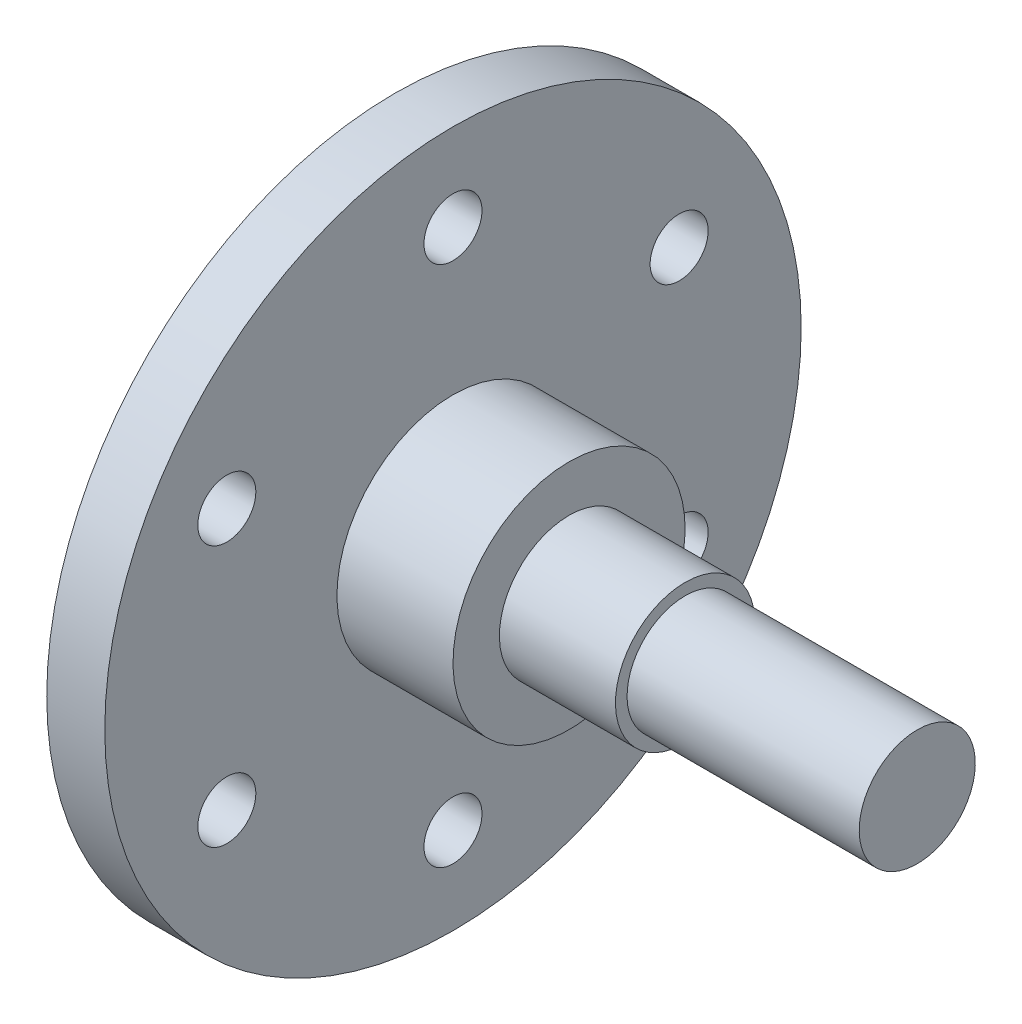
ISO-10303-21;
HEADER;
FILE_DESCRIPTION(('STEP AP214'),'2;1');
FILE_NAME('part.step','',(''),(''),'','','');
FILE_SCHEMA(('AUTOMOTIVE_DESIGN { 1 0 10303 214 1 1 1 1 }'));
ENDSEC;
DATA;
#1=APPLICATION_CONTEXT('core data for automotive mechanical design processes');
#2=APPLICATION_PROTOCOL_DEFINITION('international standard','automotive_design',2000,#1);
#3=PRODUCT_CONTEXT('',#1,'mechanical');
#4=PRODUCT('Part','Part','',(#3));
#5=PRODUCT_RELATED_PRODUCT_CATEGORY('part','',(#4));
#6=PRODUCT_DEFINITION_FORMATION('','',#4);
#7=PRODUCT_DEFINITION_CONTEXT('part definition',#1,'design');
#8=PRODUCT_DEFINITION('design','',#6,#7);
#9=PRODUCT_DEFINITION_SHAPE('','',#8);
#10=(LENGTH_UNIT() NAMED_UNIT(*) SI_UNIT(.MILLI.,.METRE.));
#11=(NAMED_UNIT(*) PLANE_ANGLE_UNIT() SI_UNIT($,.RADIAN.));
#12=(NAMED_UNIT(*) SI_UNIT($,.STERADIAN.) SOLID_ANGLE_UNIT());
#13=UNCERTAINTY_MEASURE_WITH_UNIT(LENGTH_MEASURE(1.E-05),#10,'distance_accuracy_value','');
#14=(GEOMETRIC_REPRESENTATION_CONTEXT(3) GLOBAL_UNCERTAINTY_ASSIGNED_CONTEXT((#13)) GLOBAL_UNIT_ASSIGNED_CONTEXT((#10,
#11,#12)) REPRESENTATION_CONTEXT('',''));
#15=CARTESIAN_POINT('',(0.,0.,0.));
#16=DIRECTION('',(0.,0.,1.));
#17=DIRECTION('',(1.,0.,0.));
#18=AXIS2_PLACEMENT_3D('',#15,#16,#17);
#19=CARTESIAN_POINT('',(45.,0.,0.));
#20=DIRECTION('',(-1.,0.,0.));
#21=DIRECTION('',(0.,-1.,0.));
#22=AXIS2_PLACEMENT_3D('',#19,#20,#21);
#23=PLANE('',#22);
#24=CARTESIAN_POINT('',(45.,0.,0.));
#25=DIRECTION('',(1.,0.,0.));
#26=DIRECTION('',(0.,1.,0.));
#27=AXIS2_PLACEMENT_3D('',#24,#25,#26);
#28=CIRCLE('',#27,5.);
#29=CARTESIAN_POINT('',(45.,5.,0.));
#30=VERTEX_POINT('',#29);
#31=EDGE_CURVE('E10',#30,#30,#28,.T.);
#32=ORIENTED_EDGE('',*,*,#31,.T.);
#33=EDGE_LOOP('',(#32));
#34=FACE_BOUND('',#33,.T.);
#35=ADVANCED_FACE('F44',(#34),#23,.F.);
#36=CARTESIAN_POINT('',(45.,0.,0.));
#37=DIRECTION('',(1.,0.,0.));
#38=DIRECTION('',(0.,1.,0.));
#39=AXIS2_PLACEMENT_3D('',#36,#37,#38);
#40=CYLINDRICAL_SURFACE('',#39,5.);
#41=ORIENTED_EDGE('',*,*,#31,.F.);
#42=EDGE_LOOP('',(#41));
#43=FACE_BOUND('',#42,.T.);
#44=CARTESIAN_POINT('',(25.,0.,0.));
#45=DIRECTION('',(1.,0.,0.));
#46=DIRECTION('',(0.,1.,0.));
#47=AXIS2_PLACEMENT_3D('',#44,#45,#46);
#48=CIRCLE('',#47,5.);
#49=CARTESIAN_POINT('',(25.,5.,0.));
#50=VERTEX_POINT('',#49);
#51=EDGE_CURVE('E51',#50,#50,#48,.T.);
#52=ORIENTED_EDGE('',*,*,#51,.T.);
#53=EDGE_LOOP('',(#52));
#54=FACE_BOUND('',#53,.T.);
#55=ADVANCED_FACE('F150',(#43,#54),#40,.T.);
#56=CARTESIAN_POINT('',(25.,0.,0.));
#57=DIRECTION('',(-1.,0.,0.));
#58=DIRECTION('',(0.,-1.,0.));
#59=AXIS2_PLACEMENT_3D('',#56,#57,#58);
#60=PLANE('',#59);
#61=ORIENTED_EDGE('',*,*,#51,.F.);
#62=EDGE_LOOP('',(#61));
#63=FACE_BOUND('',#62,.T.);
#64=CARTESIAN_POINT('',(25.,0.,0.));
#65=DIRECTION('',(1.,0.,0.));
#66=DIRECTION('',(0.,1.,0.));
#67=AXIS2_PLACEMENT_3D('',#64,#65,#66);
#68=CIRCLE('',#67,6.);
#69=CARTESIAN_POINT('',(25.,6.,0.));
#70=VERTEX_POINT('',#69);
#71=EDGE_CURVE('E54',#70,#70,#68,.T.);
#72=ORIENTED_EDGE('',*,*,#71,.T.);
#73=EDGE_LOOP('',(#72));
#74=FACE_BOUND('',#73,.T.);
#75=ADVANCED_FACE('F151',(#63,#74),#60,.F.);
#76=CARTESIAN_POINT('',(45.,0.,0.));
#77=DIRECTION('',(1.,0.,0.));
#78=DIRECTION('',(0.,1.,0.));
#79=AXIS2_PLACEMENT_3D('',#76,#77,#78);
#80=CYLINDRICAL_SURFACE('',#79,6.);
#81=ORIENTED_EDGE('',*,*,#71,.F.);
#82=EDGE_LOOP('',(#81));
#83=FACE_BOUND('',#82,.T.);
#84=CARTESIAN_POINT('',(15.,0.,0.));
#85=DIRECTION('',(1.,0.,0.));
#86=DIRECTION('',(0.,1.,0.));
#87=AXIS2_PLACEMENT_3D('',#84,#85,#86);
#88=CIRCLE('',#87,5.99999999999999);
#89=CARTESIAN_POINT('',(15.,5.99999999999999,0.));
#90=VERTEX_POINT('',#89);
#91=EDGE_CURVE('E56',#90,#90,#88,.T.);
#92=ORIENTED_EDGE('',*,*,#91,.T.);
#93=EDGE_LOOP('',(#92));
#94=FACE_BOUND('',#93,.T.);
#95=ADVANCED_FACE('F156',(#83,#94),#80,.T.);
#96=CARTESIAN_POINT('',(15.,0.,0.));
#97=DIRECTION('',(-1.,0.,0.));
#98=DIRECTION('',(0.,-1.,0.));
#99=AXIS2_PLACEMENT_3D('',#96,#97,#98);
#100=PLANE('',#99);
#101=ORIENTED_EDGE('',*,*,#91,.F.);
#102=EDGE_LOOP('',(#101));
#103=FACE_BOUND('',#102,.T.);
#104=CARTESIAN_POINT('',(15.,0.,0.));
#105=DIRECTION('',(1.,0.,0.));
#106=DIRECTION('',(0.,1.,0.));
#107=AXIS2_PLACEMENT_3D('',#104,#105,#106);
#108=CIRCLE('',#107,9.99999999999999);
#109=CARTESIAN_POINT('',(15.,9.99999999999999,0.));
#110=VERTEX_POINT('',#109);
#111=EDGE_CURVE('E61',#110,#110,#108,.T.);
#112=ORIENTED_EDGE('',*,*,#111,.T.);
#113=EDGE_LOOP('',(#112));
#114=FACE_BOUND('',#113,.T.);
#115=ADVANCED_FACE('F165',(#103,#114),#100,.F.);
#116=CARTESIAN_POINT('',(45.,0.,0.));
#117=DIRECTION('',(1.,0.,0.));
#118=DIRECTION('',(0.,1.,0.));
#119=AXIS2_PLACEMENT_3D('',#116,#117,#118);
#120=CYLINDRICAL_SURFACE('',#119,9.99999999999999);
#121=ORIENTED_EDGE('',*,*,#111,.F.);
#122=EDGE_LOOP('',(#121));
#123=FACE_BOUND('',#122,.T.);
#124=CARTESIAN_POINT('',(5.,0.,0.));
#125=DIRECTION('',(1.,0.,0.));
#126=DIRECTION('',(0.,1.,0.));
#127=AXIS2_PLACEMENT_3D('',#124,#125,#126);
#128=CIRCLE('',#127,9.99999999999999);
#129=CARTESIAN_POINT('',(5.,9.99999999999999,0.));
#130=VERTEX_POINT('',#129);
#131=EDGE_CURVE('E70',#130,#130,#128,.T.);
#132=ORIENTED_EDGE('',*,*,#131,.T.);
#133=EDGE_LOOP('',(#132));
#134=FACE_BOUND('',#133,.T.);
#135=ADVANCED_FACE('F142',(#123,#134),#120,.T.);
#136=CARTESIAN_POINT('',(4.99999999999999,0.,0.));
#137=DIRECTION('',(-1.,0.,0.));
#138=DIRECTION('',(0.,-1.,0.));
#139=AXIS2_PLACEMENT_3D('',#136,#137,#138);
#140=PLANE('',#139);
#141=CARTESIAN_POINT('',(4.99999999999999,22.5,-1.55528883222884E-13));
#142=DIRECTION('',(-1.,0.,0.));
#143=DIRECTION('',(0.,-1.,0.));
#144=AXIS2_PLACEMENT_3D('',#141,#142,#143);
#145=CIRCLE('',#144,2.5);
#146=CARTESIAN_POINT('',(4.99999999999998,20.,-1.55528883222884E-13));
#147=VERTEX_POINT('',#146);
#148=EDGE_CURVE('E77',#147,#147,#145,.T.);
#149=ORIENTED_EDGE('',*,*,#148,.T.);
#150=EDGE_LOOP('',(#149));
#151=FACE_BOUND('',#150,.T.);
#152=CARTESIAN_POINT('',(4.99999999999999,11.2500000000037,-19.4855715851479));
#153=DIRECTION('',(-1.,0.,0.));
#154=DIRECTION('',(0.,-1.,0.));
#155=AXIS2_PLACEMENT_3D('',#152,#153,#154);
#156=CIRCLE('',#155,2.5);
#157=CARTESIAN_POINT('',(4.99999999999998,8.75000000000367,-19.4855715851479));
#158=VERTEX_POINT('',#157);
#159=EDGE_CURVE('E76',#158,#158,#156,.T.);
#160=ORIENTED_EDGE('',*,*,#159,.T.);
#161=EDGE_LOOP('',(#160));
#162=FACE_BOUND('',#161,.T.);
#163=CARTESIAN_POINT('',(4.99999999999999,-11.2499999999971,-19.4855715851517));
#164=DIRECTION('',(-1.,0.,0.));
#165=DIRECTION('',(0.,-1.,0.));
#166=AXIS2_PLACEMENT_3D('',#163,#164,#165);
#167=CIRCLE('',#166,2.5);
#168=CARTESIAN_POINT('',(4.99999999999998,-13.7499999999971,-19.4855715851517));
#169=VERTEX_POINT('',#168);
#170=EDGE_CURVE('E85',#169,#169,#167,.T.);
#171=ORIENTED_EDGE('',*,*,#170,.T.);
#172=EDGE_LOOP('',(#171));
#173=FACE_BOUND('',#172,.T.);
#174=CARTESIAN_POINT('',(4.99999999999999,-22.5,-2.69074326221791E-12));
#175=DIRECTION('',(-1.,0.,0.));
#176=DIRECTION('',(0.,-1.,0.));
#177=AXIS2_PLACEMENT_3D('',#174,#175,#176);
#178=CIRCLE('',#177,2.5);
#179=CARTESIAN_POINT('',(4.99999999999998,-25.,-2.69074326221791E-12));
#180=VERTEX_POINT('',#179);
#181=EDGE_CURVE('E84',#180,#180,#178,.T.);
#182=ORIENTED_EDGE('',*,*,#181,.T.);
#183=EDGE_LOOP('',(#182));
#184=FACE_BOUND('',#183,.T.);
#185=CARTESIAN_POINT('',(4.99999999999999,-11.2500000000015,19.4855715851489));
#186=DIRECTION('',(-1.,0.,0.));
#187=DIRECTION('',(0.,-1.,0.));
#188=AXIS2_PLACEMENT_3D('',#185,#186,#187);
#189=CIRCLE('',#188,2.5);
#190=CARTESIAN_POINT('',(4.99999999999998,-13.7500000000015,19.4855715851489));
#191=VERTEX_POINT('',#190);
#192=EDGE_CURVE('E86',#191,#191,#189,.T.);
#193=ORIENTED_EDGE('',*,*,#192,.T.);
#194=EDGE_LOOP('',(#193));
#195=FACE_BOUND('',#194,.T.);
#196=CARTESIAN_POINT('',(4.99999999999999,11.2499999999993,19.4855715851501));
#197=DIRECTION('',(-1.,0.,0.));
#198=DIRECTION('',(0.,-1.,0.));
#199=AXIS2_PLACEMENT_3D('',#196,#197,#198);
#200=CIRCLE('',#199,2.5);
#201=CARTESIAN_POINT('',(4.99999999999998,8.74999999999927,19.4855715851501));
#202=VERTEX_POINT('',#201);
#203=EDGE_CURVE('E93',#202,#202,#200,.T.);
#204=ORIENTED_EDGE('',*,*,#203,.T.);
#205=EDGE_LOOP('',(#204));
#206=FACE_BOUND('',#205,.T.);
#207=ORIENTED_EDGE('',*,*,#131,.F.);
#208=EDGE_LOOP('',(#207));
#209=FACE_BOUND('',#208,.T.);
#210=CARTESIAN_POINT('',(4.99999999999999,0.,0.));
#211=DIRECTION('',(1.,0.,0.));
#212=DIRECTION('',(0.,1.,0.));
#213=AXIS2_PLACEMENT_3D('',#210,#211,#212);
#214=CIRCLE('',#213,30.);
#215=CARTESIAN_POINT('',(4.99999999999999,30.,0.));
#216=VERTEX_POINT('',#215);
#217=EDGE_CURVE('E69',#216,#216,#214,.T.);
#218=ORIENTED_EDGE('',*,*,#217,.T.);
#219=EDGE_LOOP('',(#218));
#220=FACE_BOUND('',#219,.T.);
#221=ADVANCED_FACE('F133',(#151,#162,#173,#184,#195,#206,#209,#220),#140,.F.);
#222=CARTESIAN_POINT('',(45.,0.,0.));
#223=DIRECTION('',(1.,0.,0.));
#224=DIRECTION('',(0.,1.,0.));
#225=AXIS2_PLACEMENT_3D('',#222,#223,#224);
#226=CYLINDRICAL_SURFACE('',#225,30.);
#227=ORIENTED_EDGE('',*,*,#217,.F.);
#228=EDGE_LOOP('',(#227));
#229=FACE_BOUND('',#228,.T.);
#230=CARTESIAN_POINT('',(0.,0.,0.));
#231=DIRECTION('',(1.,0.,0.));
#232=DIRECTION('',(0.,1.,0.));
#233=AXIS2_PLACEMENT_3D('',#230,#231,#232);
#234=CIRCLE('',#233,30.);
#235=CARTESIAN_POINT('',(0.,30.,0.));
#236=VERTEX_POINT('',#235);
#237=EDGE_CURVE('E71',#236,#236,#234,.T.);
#238=ORIENTED_EDGE('',*,*,#237,.T.);
#239=EDGE_LOOP('',(#238));
#240=FACE_BOUND('',#239,.T.);
#241=ADVANCED_FACE('F118',(#229,#240),#226,.T.);
#242=CARTESIAN_POINT('',(0.,0.,0.));
#243=DIRECTION('',(1.,0.,0.));
#244=DIRECTION('',(0.,1.,0.));
#245=AXIS2_PLACEMENT_3D('',#242,#243,#244);
#246=PLANE('',#245);
#247=CARTESIAN_POINT('',(0.,22.5,-1.55528883222884E-13));
#248=DIRECTION('',(-1.,0.,0.));
#249=DIRECTION('',(0.,-1.,0.));
#250=AXIS2_PLACEMENT_3D('',#247,#248,#249);
#251=CIRCLE('',#250,2.5);
#252=CARTESIAN_POINT('',(0.,20.,-1.55528883222884E-13));
#253=VERTEX_POINT('',#252);
#254=EDGE_CURVE('E94',#253,#253,#251,.T.);
#255=ORIENTED_EDGE('',*,*,#254,.F.);
#256=EDGE_LOOP('',(#255));
#257=FACE_BOUND('',#256,.T.);
#258=CARTESIAN_POINT('',(0.,11.2500000000037,-19.4855715851479));
#259=DIRECTION('',(-1.,0.,0.));
#260=DIRECTION('',(0.,-1.,0.));
#261=AXIS2_PLACEMENT_3D('',#258,#259,#260);
#262=CIRCLE('',#261,2.5);
#263=CARTESIAN_POINT('',(0.,8.75000000000367,-19.4855715851479));
#264=VERTEX_POINT('',#263);
#265=EDGE_CURVE('E97',#264,#264,#262,.T.);
#266=ORIENTED_EDGE('',*,*,#265,.F.);
#267=EDGE_LOOP('',(#266));
#268=FACE_BOUND('',#267,.T.);
#269=CARTESIAN_POINT('',(0.,-11.2499999999971,-19.4855715851517));
#270=DIRECTION('',(-1.,0.,0.));
#271=DIRECTION('',(0.,-1.,0.));
#272=AXIS2_PLACEMENT_3D('',#269,#270,#271);
#273=CIRCLE('',#272,2.5);
#274=CARTESIAN_POINT('',(0.,-13.7499999999971,-19.4855715851517));
#275=VERTEX_POINT('',#274);
#276=EDGE_CURVE('E92',#275,#275,#273,.T.);
#277=ORIENTED_EDGE('',*,*,#276,.F.);
#278=EDGE_LOOP('',(#277));
#279=FACE_BOUND('',#278,.T.);
#280=CARTESIAN_POINT('',(0.,-22.5,-2.69074326221791E-12));
#281=DIRECTION('',(-1.,0.,0.));
#282=DIRECTION('',(0.,-1.,0.));
#283=AXIS2_PLACEMENT_3D('',#280,#281,#282);
#284=CIRCLE('',#283,2.5);
#285=CARTESIAN_POINT('',(0.,-25.,-2.69074326221791E-12));
#286=VERTEX_POINT('',#285);
#287=EDGE_CURVE('E98',#286,#286,#284,.T.);
#288=ORIENTED_EDGE('',*,*,#287,.F.);
#289=EDGE_LOOP('',(#288));
#290=FACE_BOUND('',#289,.T.);
#291=CARTESIAN_POINT('',(0.,-11.2500000000015,19.4855715851489));
#292=DIRECTION('',(-1.,0.,0.));
#293=DIRECTION('',(0.,-1.,0.));
#294=AXIS2_PLACEMENT_3D('',#291,#292,#293);
#295=CIRCLE('',#294,2.5);
#296=CARTESIAN_POINT('',(0.,-13.7500000000015,19.4855715851489));
#297=VERTEX_POINT('',#296);
#298=EDGE_CURVE('E105',#297,#297,#295,.T.);
#299=ORIENTED_EDGE('',*,*,#298,.F.);
#300=EDGE_LOOP('',(#299));
#301=FACE_BOUND('',#300,.T.);
#302=CARTESIAN_POINT('',(0.,11.2499999999993,19.4855715851501));
#303=DIRECTION('',(-1.,0.,0.));
#304=DIRECTION('',(0.,-1.,0.));
#305=AXIS2_PLACEMENT_3D('',#302,#303,#304);
#306=CIRCLE('',#305,2.5);
#307=CARTESIAN_POINT('',(0.,8.74999999999927,19.4855715851501));
#308=VERTEX_POINT('',#307);
#309=EDGE_CURVE('E104',#308,#308,#306,.T.);
#310=ORIENTED_EDGE('',*,*,#309,.F.);
#311=EDGE_LOOP('',(#310));
#312=FACE_BOUND('',#311,.T.);
#313=ORIENTED_EDGE('',*,*,#237,.F.);
#314=EDGE_LOOP('',(#313));
#315=FACE_BOUND('',#314,.T.);
#316=ADVANCED_FACE('F117',(#257,#268,#279,#290,#301,#312,#315),#246,.F.);
#317=CARTESIAN_POINT('',(45.,11.2499999999993,19.4855715851501));
#318=DIRECTION('',(-1.,0.,0.));
#319=DIRECTION('',(0.,-1.,0.));
#320=AXIS2_PLACEMENT_3D('',#317,#318,#319);
#321=CYLINDRICAL_SURFACE('',#320,2.5);
#322=CARTESIAN_POINT('',(0.,8.74999999999927,19.4855715851501));
#323=CARTESIAN_POINT('',(0.0520833333333392,8.74999999999927,19.4855715851501));
#324=CARTESIAN_POINT('',(0.104166666666671,8.74999999999927,19.4855715851501));
#325=CARTESIAN_POINT('',(0.208333333333338,8.74999999999927,19.4855715851501));
#326=CARTESIAN_POINT('',(0.260416666666673,8.74999999999927,19.4855715851501));
#327=CARTESIAN_POINT('',(0.364583333333339,8.74999999999927,19.4855715851501));
#328=CARTESIAN_POINT('',(0.416666666666672,8.74999999999927,19.4855715851501));
#329=CARTESIAN_POINT('',(0.520833333333338,8.74999999999927,19.4855715851501));
#330=CARTESIAN_POINT('',(0.572916666666673,8.74999999999927,19.4855715851501));
#331=CARTESIAN_POINT('',(0.67708333333334,8.74999999999927,19.4855715851501));
#332=CARTESIAN_POINT('',(0.729166666666672,8.74999999999927,19.4855715851501));
#333=CARTESIAN_POINT('',(0.833333333333336,8.74999999999927,19.4855715851501));
#334=CARTESIAN_POINT('',(0.885416666666669,8.74999999999927,19.4855715851501));
#335=CARTESIAN_POINT('',(0.989583333333335,8.74999999999927,19.4855715851501));
#336=CARTESIAN_POINT('',(1.04166666666667,8.74999999999927,19.4855715851501));
#337=CARTESIAN_POINT('',(1.14583333333334,8.74999999999927,19.4855715851501));
#338=CARTESIAN_POINT('',(1.19791666666667,8.74999999999927,19.4855715851501));
#339=CARTESIAN_POINT('',(1.30208333333333,8.74999999999927,19.4855715851501));
#340=CARTESIAN_POINT('',(1.35416666666667,8.74999999999927,19.4855715851501));
#341=CARTESIAN_POINT('',(1.45833333333333,8.74999999999927,19.4855715851501));
#342=CARTESIAN_POINT('',(1.51041666666667,8.74999999999927,19.4855715851501));
#343=CARTESIAN_POINT('',(1.61458333333333,8.74999999999927,19.4855715851501));
#344=CARTESIAN_POINT('',(1.66666666666667,8.74999999999927,19.4855715851501));
#345=CARTESIAN_POINT('',(1.77083333333333,8.74999999999927,19.4855715851501));
#346=CARTESIAN_POINT('',(1.82291666666666,8.74999999999927,19.4855715851501));
#347=CARTESIAN_POINT('',(1.92708333333333,8.74999999999927,19.4855715851501));
#348=CARTESIAN_POINT('',(1.97916666666666,8.74999999999927,19.4855715851501));
#349=CARTESIAN_POINT('',(2.08333333333333,8.74999999999927,19.4855715851501));
#350=CARTESIAN_POINT('',(2.13541666666666,8.74999999999927,19.4855715851501));
#351=CARTESIAN_POINT('',(2.23958333333333,8.74999999999927,19.4855715851501));
#352=CARTESIAN_POINT('',(2.29166666666666,8.74999999999927,19.4855715851501));
#353=CARTESIAN_POINT('',(2.39583333333333,8.74999999999927,19.4855715851501));
#354=CARTESIAN_POINT('',(2.44791666666666,8.74999999999927,19.4855715851501));
#355=CARTESIAN_POINT('',(2.55208333333333,8.74999999999927,19.4855715851501));
#356=CARTESIAN_POINT('',(2.60416666666666,8.74999999999927,19.4855715851501));
#357=CARTESIAN_POINT('',(2.70833333333333,8.74999999999927,19.4855715851501));
#358=CARTESIAN_POINT('',(2.76041666666666,8.74999999999927,19.4855715851501));
#359=CARTESIAN_POINT('',(2.86458333333333,8.74999999999927,19.4855715851501));
#360=CARTESIAN_POINT('',(2.91666666666666,8.74999999999927,19.4855715851501));
#361=CARTESIAN_POINT('',(3.02083333333333,8.74999999999927,19.4855715851501));
#362=CARTESIAN_POINT('',(3.07291666666666,8.74999999999927,19.4855715851501));
#363=CARTESIAN_POINT('',(3.17708333333333,8.74999999999927,19.4855715851501));
#364=CARTESIAN_POINT('',(3.22916666666666,8.74999999999927,19.4855715851501));
#365=CARTESIAN_POINT('',(3.33333333333333,8.74999999999927,19.4855715851501));
#366=CARTESIAN_POINT('',(3.38541666666666,8.74999999999927,19.4855715851501));
#367=CARTESIAN_POINT('',(3.48958333333332,8.74999999999927,19.4855715851501));
#368=CARTESIAN_POINT('',(3.54166666666666,8.74999999999927,19.4855715851501));
#369=CARTESIAN_POINT('',(3.64583333333333,8.74999999999927,19.4855715851501));
#370=CARTESIAN_POINT('',(3.69791666666666,8.74999999999927,19.4855715851501));
#371=CARTESIAN_POINT('',(3.80208333333332,8.74999999999927,19.4855715851501));
#372=CARTESIAN_POINT('',(3.85416666666665,8.74999999999927,19.4855715851501));
#373=CARTESIAN_POINT('',(3.95833333333332,8.74999999999927,19.4855715851501));
#374=CARTESIAN_POINT('',(4.01041666666666,8.74999999999927,19.4855715851501));
#375=CARTESIAN_POINT('',(4.11458333333332,8.74999999999927,19.4855715851501));
#376=CARTESIAN_POINT('',(4.16666666666665,8.74999999999927,19.4855715851501));
#377=CARTESIAN_POINT('',(4.27083333333332,8.74999999999927,19.4855715851501));
#378=CARTESIAN_POINT('',(4.32291666666665,8.74999999999927,19.4855715851501));
#379=CARTESIAN_POINT('',(4.42708333333332,8.74999999999927,19.4855715851501));
#380=CARTESIAN_POINT('',(4.47916666666665,8.74999999999927,19.4855715851501));
#381=CARTESIAN_POINT('',(4.58333333333332,8.74999999999927,19.4855715851501));
#382=CARTESIAN_POINT('',(4.63541666666665,8.74999999999927,19.4855715851501));
#383=CARTESIAN_POINT('',(4.73958333333332,8.74999999999927,19.4855715851501));
#384=CARTESIAN_POINT('',(4.79166666666665,8.74999999999927,19.4855715851501));
#385=CARTESIAN_POINT('',(4.89583333333332,8.74999999999927,19.4855715851501));
#386=CARTESIAN_POINT('',(4.94791666666665,8.74999999999927,19.4855715851501));
#387=CARTESIAN_POINT('',(4.99999999999998,8.74999999999927,19.4855715851501));
#388=B_SPLINE_CURVE_WITH_KNOTS('',3,(#322,#323,#324,#325,#326,#327,#328,#329,#330,#331,#332,
#333,#334,#335,#336,#337,#338,#339,#340,#341,#342,#343,#344,#345,#346,#347,#348,#349,#350,#351,
#352,#353,#354,#355,#356,#357,#358,#359,#360,#361,#362,#363,#364,#365,#366,#367,#368,#369,#370,
#371,#372,#373,#374,#375,#376,#377,#378,#379,#380,#381,#382,#383,#384,#385,#386,#387),
.UNSPECIFIED.,.F.,.F.,(4,2,2,2,2,2,2,2,2,2,2,2,2,2,2,2,2,2,2,2,2,2,2,2,2,2,2,2,2,2,2,2,4),(0.,
0.156249999999997,0.3125,0.468749999999997,0.625000000000001,0.781249999999997,
0.937499999999994,1.09375,1.24999999999999,1.40624999999999,1.56249999999999,1.71874999999999,
1.87499999999999,2.03124999999999,2.18749999999999,2.34374999999999,2.49999999999999,
2.65624999999998,2.81249999999999,2.96874999999999,3.12499999999999,3.28124999999999,
3.43749999999998,3.59374999999999,3.74999999999998,3.90624999999998,4.06249999999998,
4.21874999999998,4.37499999999998,4.53124999999998,4.68749999999998,4.84374999999998,
4.99999999999998),.UNSPECIFIED.);
#389=EDGE_CURVE('BSEAM116',#308,#202,#388,.T.);
#390=ORIENTED_EDGE('',*,*,#309,.T.);
#391=ORIENTED_EDGE('',*,*,#203,.F.);
#392=ORIENTED_EDGE('',*,*,#389,.T.);
#393=ORIENTED_EDGE('',*,*,#389,.F.);
#394=EDGE_LOOP('',(#390,#392,#391,#393));
#395=FACE_BOUND('',#394,.T.);
#396=ADVANCED_FACE('F116',(#395),#321,.F.);
#397=CARTESIAN_POINT('',(45.,-11.2500000000015,19.4855715851489));
#398=DIRECTION('',(-1.,0.,0.));
#399=DIRECTION('',(0.,-1.,0.));
#400=AXIS2_PLACEMENT_3D('',#397,#398,#399);
#401=CYLINDRICAL_SURFACE('',#400,2.5);
#402=CARTESIAN_POINT('',(0.,-13.7500000000015,19.4855715851489));
#403=CARTESIAN_POINT('',(0.0520833333333253,-13.7500000000015,19.4855715851489));
#404=CARTESIAN_POINT('',(0.104166666666657,-13.7500000000015,19.4855715851489));
#405=CARTESIAN_POINT('',(0.208333333333324,-13.7500000000015,19.4855715851489));
#406=CARTESIAN_POINT('',(0.260416666666659,-13.7500000000015,19.4855715851489));
#407=CARTESIAN_POINT('',(0.364583333333326,-13.7500000000015,19.4855715851489));
#408=CARTESIAN_POINT('',(0.416666666666658,-13.7500000000015,19.4855715851489));
#409=CARTESIAN_POINT('',(0.520833333333325,-13.7500000000015,19.4855715851489));
#410=CARTESIAN_POINT('',(0.572916666666659,-13.7500000000015,19.4855715851489));
#411=CARTESIAN_POINT('',(0.677083333333326,-13.7500000000015,19.4855715851489));
#412=CARTESIAN_POINT('',(0.729166666666658,-13.7500000000015,19.4855715851489));
#413=CARTESIAN_POINT('',(0.833333333333325,-13.7500000000015,19.4855715851489));
#414=CARTESIAN_POINT('',(0.885416666666659,-13.7500000000015,19.4855715851489));
#415=CARTESIAN_POINT('',(0.989583333333326,-13.7500000000015,19.4855715851489));
#416=CARTESIAN_POINT('',(1.04166666666666,-13.7500000000015,19.4855715851489));
#417=CARTESIAN_POINT('',(1.14583333333333,-13.7500000000015,19.4855715851489));
#418=CARTESIAN_POINT('',(1.19791666666666,-13.7500000000015,19.4855715851489));
#419=CARTESIAN_POINT('',(1.30208333333333,-13.7500000000015,19.4855715851489));
#420=CARTESIAN_POINT('',(1.35416666666666,-13.7500000000015,19.4855715851489));
#421=CARTESIAN_POINT('',(1.45833333333332,-13.7500000000015,19.4855715851489));
#422=CARTESIAN_POINT('',(1.51041666666666,-13.7500000000015,19.4855715851489));
#423=CARTESIAN_POINT('',(1.61458333333332,-13.7500000000015,19.4855715851489));
#424=CARTESIAN_POINT('',(1.66666666666666,-13.7500000000015,19.4855715851489));
#425=CARTESIAN_POINT('',(1.77083333333332,-13.7500000000015,19.4855715851489));
#426=CARTESIAN_POINT('',(1.82291666666666,-13.7500000000015,19.4855715851489));
#427=CARTESIAN_POINT('',(1.92708333333332,-13.7500000000015,19.4855715851489));
#428=CARTESIAN_POINT('',(1.97916666666666,-13.7500000000015,19.4855715851489));
#429=CARTESIAN_POINT('',(2.08333333333332,-13.7500000000015,19.4855715851489));
#430=CARTESIAN_POINT('',(2.13541666666666,-13.7500000000015,19.4855715851489));
#431=CARTESIAN_POINT('',(2.23958333333332,-13.7500000000015,19.4855715851489));
#432=CARTESIAN_POINT('',(2.29166666666666,-13.7500000000015,19.4855715851489));
#433=CARTESIAN_POINT('',(2.39583333333332,-13.7500000000015,19.4855715851489));
#434=CARTESIAN_POINT('',(2.44791666666666,-13.7500000000015,19.4855715851489));
#435=CARTESIAN_POINT('',(2.55208333333332,-13.7500000000015,19.4855715851489));
#436=CARTESIAN_POINT('',(2.60416666666665,-13.7500000000015,19.4855715851489));
#437=CARTESIAN_POINT('',(2.70833333333332,-13.7500000000015,19.4855715851489));
#438=CARTESIAN_POINT('',(2.76041666666665,-13.7500000000015,19.4855715851489));
#439=CARTESIAN_POINT('',(2.86458333333332,-13.7500000000015,19.4855715851489));
#440=CARTESIAN_POINT('',(2.91666666666665,-13.7500000000015,19.4855715851489));
#441=CARTESIAN_POINT('',(3.02083333333332,-13.7500000000015,19.4855715851489));
#442=CARTESIAN_POINT('',(3.07291666666665,-13.7500000000015,19.4855715851489));
#443=CARTESIAN_POINT('',(3.17708333333332,-13.7500000000015,19.4855715851489));
#444=CARTESIAN_POINT('',(3.22916666666665,-13.7500000000015,19.4855715851489));
#445=CARTESIAN_POINT('',(3.33333333333332,-13.7500000000015,19.4855715851489));
#446=CARTESIAN_POINT('',(3.38541666666665,-13.7500000000015,19.4855715851489));
#447=CARTESIAN_POINT('',(3.48958333333332,-13.7500000000015,19.4855715851489));
#448=CARTESIAN_POINT('',(3.54166666666665,-13.7500000000015,19.4855715851489));
#449=CARTESIAN_POINT('',(3.64583333333332,-13.7500000000015,19.4855715851489));
#450=CARTESIAN_POINT('',(3.69791666666665,-13.7500000000015,19.4855715851489));
#451=CARTESIAN_POINT('',(3.80208333333332,-13.7500000000015,19.4855715851489));
#452=CARTESIAN_POINT('',(3.85416666666665,-13.7500000000015,19.4855715851489));
#453=CARTESIAN_POINT('',(3.95833333333332,-13.7500000000015,19.4855715851489));
#454=CARTESIAN_POINT('',(4.01041666666665,-13.7500000000015,19.4855715851489));
#455=CARTESIAN_POINT('',(4.11458333333332,-13.7500000000015,19.4855715851489));
#456=CARTESIAN_POINT('',(4.16666666666665,-13.7500000000015,19.4855715851489));
#457=CARTESIAN_POINT('',(4.27083333333332,-13.7500000000015,19.4855715851489));
#458=CARTESIAN_POINT('',(4.32291666666665,-13.7500000000015,19.4855715851489));
#459=CARTESIAN_POINT('',(4.42708333333332,-13.7500000000015,19.4855715851489));
#460=CARTESIAN_POINT('',(4.47916666666665,-13.7500000000015,19.4855715851489));
#461=CARTESIAN_POINT('',(4.58333333333332,-13.7500000000015,19.4855715851489));
#462=CARTESIAN_POINT('',(4.63541666666665,-13.7500000000015,19.4855715851489));
#463=CARTESIAN_POINT('',(4.73958333333332,-13.7500000000015,19.4855715851489));
#464=CARTESIAN_POINT('',(4.79166666666665,-13.7500000000015,19.4855715851489));
#465=CARTESIAN_POINT('',(4.89583333333332,-13.7500000000015,19.4855715851489));
#466=CARTESIAN_POINT('',(4.94791666666665,-13.7500000000015,19.4855715851489));
#467=CARTESIAN_POINT('',(4.99999999999998,-13.7500000000015,19.4855715851489));
#468=B_SPLINE_CURVE_WITH_KNOTS('',3,(#402,#403,#404,#405,#406,#407,#408,#409,#410,#411,#412,
#413,#414,#415,#416,#417,#418,#419,#420,#421,#422,#423,#424,#425,#426,#427,#428,#429,#430,#431,
#432,#433,#434,#435,#436,#437,#438,#439,#440,#441,#442,#443,#444,#445,#446,#447,#448,#449,#450,
#451,#452,#453,#454,#455,#456,#457,#458,#459,#460,#461,#462,#463,#464,#465,#466,#467),
.UNSPECIFIED.,.F.,.F.,(4,2,2,2,2,2,2,2,2,2,2,2,2,2,2,2,2,2,2,2,2,2,2,2,2,2,2,2,2,2,2,2,4),(0.,
0.156249999999997,0.3125,0.468749999999997,0.625000000000001,0.781249999999997,
0.937500000000001,1.09375,1.25,1.40625,1.56249999999999,1.71875,1.87499999999999,2.03125,2.1875,
2.34375,2.5,2.65624999999999,2.8125,2.96874999999999,3.125,3.28124999999999,3.4375,
3.59374999999999,3.74999999999999,3.90624999999999,4.06249999999999,4.21874999999999,
4.37499999999999,4.53124999999999,4.68749999999999,4.84374999999999,4.99999999999999),.UNSPECIFIED.);
#469=EDGE_CURVE('BSEAM223',#297,#191,#468,.T.);
#470=ORIENTED_EDGE('',*,*,#298,.T.);
#471=ORIENTED_EDGE('',*,*,#192,.F.);
#472=ORIENTED_EDGE('',*,*,#469,.T.);
#473=ORIENTED_EDGE('',*,*,#469,.F.);
#474=EDGE_LOOP('',(#470,#472,#471,#473));
#475=FACE_BOUND('',#474,.T.);
#476=ADVANCED_FACE('F223',(#475),#401,.F.);
#477=CARTESIAN_POINT('',(45.,-22.5,-2.69074326221791E-12));
#478=DIRECTION('',(-1.,0.,0.));
#479=DIRECTION('',(0.,-1.,0.));
#480=AXIS2_PLACEMENT_3D('',#477,#478,#479);
#481=CYLINDRICAL_SURFACE('',#480,2.5);
#482=CARTESIAN_POINT('',(0.,-25.,-2.69074326221791E-12));
#483=CARTESIAN_POINT('',(0.0520833333333253,-25.,-2.69074326221791E-12));
#484=CARTESIAN_POINT('',(0.104166666666657,-25.,-2.69074326221791E-12));
#485=CARTESIAN_POINT('',(0.208333333333324,-25.,-2.69074326221791E-12));
#486=CARTESIAN_POINT('',(0.260416666666659,-25.,-2.69074326221791E-12));
#487=CARTESIAN_POINT('',(0.364583333333326,-25.,-2.69074326221791E-12));
#488=CARTESIAN_POINT('',(0.416666666666658,-25.,-2.69074326221791E-12));
#489=CARTESIAN_POINT('',(0.520833333333325,-25.,-2.69074326221791E-12));
#490=CARTESIAN_POINT('',(0.572916666666659,-25.,-2.69074326221791E-12));
#491=CARTESIAN_POINT('',(0.677083333333326,-25.,-2.69074326221791E-12));
#492=CARTESIAN_POINT('',(0.729166666666658,-25.,-2.69074326221791E-12));
#493=CARTESIAN_POINT('',(0.833333333333325,-25.,-2.69074326221791E-12));
#494=CARTESIAN_POINT('',(0.885416666666659,-25.,-2.69074326221791E-12));
#495=CARTESIAN_POINT('',(0.989583333333326,-25.,-2.69074326221791E-12));
#496=CARTESIAN_POINT('',(1.04166666666666,-25.,-2.69074326221791E-12));
#497=CARTESIAN_POINT('',(1.14583333333333,-25.,-2.69074326221791E-12));
#498=CARTESIAN_POINT('',(1.19791666666666,-25.,-2.69074326221791E-12));
#499=CARTESIAN_POINT('',(1.30208333333333,-25.,-2.69074326221791E-12));
#500=CARTESIAN_POINT('',(1.35416666666666,-25.,-2.69074326221791E-12));
#501=CARTESIAN_POINT('',(1.45833333333332,-25.,-2.69074326221791E-12));
#502=CARTESIAN_POINT('',(1.51041666666666,-25.,-2.69074326221791E-12));
#503=CARTESIAN_POINT('',(1.61458333333332,-25.,-2.69074326221791E-12));
#504=CARTESIAN_POINT('',(1.66666666666666,-25.,-2.69074326221791E-12));
#505=CARTESIAN_POINT('',(1.77083333333332,-25.,-2.69074326221791E-12));
#506=CARTESIAN_POINT('',(1.82291666666666,-25.,-2.69074326221791E-12));
#507=CARTESIAN_POINT('',(1.92708333333332,-25.,-2.69074326221791E-12));
#508=CARTESIAN_POINT('',(1.97916666666666,-25.,-2.69074326221791E-12));
#509=CARTESIAN_POINT('',(2.08333333333332,-25.,-2.69074326221791E-12));
#510=CARTESIAN_POINT('',(2.13541666666666,-25.,-2.69074326221791E-12));
#511=CARTESIAN_POINT('',(2.23958333333332,-25.,-2.69074326221791E-12));
#512=CARTESIAN_POINT('',(2.29166666666666,-25.,-2.69074326221791E-12));
#513=CARTESIAN_POINT('',(2.39583333333332,-25.,-2.69074326221791E-12));
#514=CARTESIAN_POINT('',(2.44791666666666,-25.,-2.69074326221791E-12));
#515=CARTESIAN_POINT('',(2.55208333333332,-25.,-2.69074326221791E-12));
#516=CARTESIAN_POINT('',(2.60416666666665,-25.,-2.69074326221791E-12));
#517=CARTESIAN_POINT('',(2.70833333333332,-25.,-2.69074326221791E-12));
#518=CARTESIAN_POINT('',(2.76041666666665,-25.,-2.69074326221791E-12));
#519=CARTESIAN_POINT('',(2.86458333333332,-25.,-2.69074326221791E-12));
#520=CARTESIAN_POINT('',(2.91666666666665,-25.,-2.69074326221791E-12));
#521=CARTESIAN_POINT('',(3.02083333333332,-25.,-2.69074326221791E-12));
#522=CARTESIAN_POINT('',(3.07291666666665,-25.,-2.69074326221791E-12));
#523=CARTESIAN_POINT('',(3.17708333333332,-25.,-2.69074326221791E-12));
#524=CARTESIAN_POINT('',(3.22916666666665,-25.,-2.69074326221791E-12));
#525=CARTESIAN_POINT('',(3.33333333333332,-25.,-2.69074326221791E-12));
#526=CARTESIAN_POINT('',(3.38541666666665,-25.,-2.69074326221791E-12));
#527=CARTESIAN_POINT('',(3.48958333333332,-25.,-2.69074326221791E-12));
#528=CARTESIAN_POINT('',(3.54166666666665,-25.,-2.69074326221791E-12));
#529=CARTESIAN_POINT('',(3.64583333333332,-25.,-2.69074326221791E-12));
#530=CARTESIAN_POINT('',(3.69791666666665,-25.,-2.69074326221791E-12));
#531=CARTESIAN_POINT('',(3.80208333333332,-25.,-2.69074326221791E-12));
#532=CARTESIAN_POINT('',(3.85416666666665,-25.,-2.69074326221791E-12));
#533=CARTESIAN_POINT('',(3.95833333333332,-25.,-2.69074326221791E-12));
#534=CARTESIAN_POINT('',(4.01041666666665,-25.,-2.69074326221791E-12));
#535=CARTESIAN_POINT('',(4.11458333333332,-25.,-2.69074326221791E-12));
#536=CARTESIAN_POINT('',(4.16666666666665,-25.,-2.69074326221791E-12));
#537=CARTESIAN_POINT('',(4.27083333333332,-25.,-2.69074326221791E-12));
#538=CARTESIAN_POINT('',(4.32291666666665,-25.,-2.69074326221791E-12));
#539=CARTESIAN_POINT('',(4.42708333333332,-25.,-2.69074326221791E-12));
#540=CARTESIAN_POINT('',(4.47916666666665,-25.,-2.69074326221791E-12));
#541=CARTESIAN_POINT('',(4.58333333333332,-25.,-2.69074326221791E-12));
#542=CARTESIAN_POINT('',(4.63541666666665,-25.,-2.69074326221791E-12));
#543=CARTESIAN_POINT('',(4.73958333333332,-25.,-2.69074326221791E-12));
#544=CARTESIAN_POINT('',(4.79166666666665,-25.,-2.69074326221791E-12));
#545=CARTESIAN_POINT('',(4.89583333333332,-25.,-2.69074326221791E-12));
#546=CARTESIAN_POINT('',(4.94791666666665,-25.,-2.69074326221791E-12));
#547=CARTESIAN_POINT('',(4.99999999999998,-25.,-2.69074326221791E-12));
#548=B_SPLINE_CURVE_WITH_KNOTS('',3,(#482,#483,#484,#485,#486,#487,#488,#489,#490,#491,#492,
#493,#494,#495,#496,#497,#498,#499,#500,#501,#502,#503,#504,#505,#506,#507,#508,#509,#510,#511,
#512,#513,#514,#515,#516,#517,#518,#519,#520,#521,#522,#523,#524,#525,#526,#527,#528,#529,#530,
#531,#532,#533,#534,#535,#536,#537,#538,#539,#540,#541,#542,#543,#544,#545,#546,#547),
.UNSPECIFIED.,.F.,.F.,(4,2,2,2,2,2,2,2,2,2,2,2,2,2,2,2,2,2,2,2,2,2,2,2,2,2,2,2,2,2,2,2,4),(0.,
0.156249999999997,0.3125,0.468749999999997,0.625000000000001,0.781249999999997,
0.937500000000001,1.09375,1.25,1.40625,1.56249999999999,1.71875,1.87499999999999,2.03125,2.1875,
2.34375,2.5,2.65624999999999,2.8125,2.96874999999999,3.125,3.28124999999999,3.4375,
3.59374999999999,3.74999999999999,3.90624999999999,4.06249999999999,4.21874999999999,
4.37499999999999,4.53124999999999,4.68749999999999,4.84374999999999,4.99999999999999),.UNSPECIFIED.);
#549=EDGE_CURVE('BSEAM232',#286,#180,#548,.T.);
#550=ORIENTED_EDGE('',*,*,#287,.T.);
#551=ORIENTED_EDGE('',*,*,#181,.F.);
#552=ORIENTED_EDGE('',*,*,#549,.T.);
#553=ORIENTED_EDGE('',*,*,#549,.F.);
#554=EDGE_LOOP('',(#550,#552,#551,#553));
#555=FACE_BOUND('',#554,.T.);
#556=ADVANCED_FACE('F232',(#555),#481,.F.);
#557=CARTESIAN_POINT('',(45.,-11.2499999999971,-19.4855715851517));
#558=DIRECTION('',(-1.,0.,0.));
#559=DIRECTION('',(0.,-1.,0.));
#560=AXIS2_PLACEMENT_3D('',#557,#558,#559);
#561=CYLINDRICAL_SURFACE('',#560,2.5);
#562=CARTESIAN_POINT('',(0.,-13.7499999999971,-19.4855715851517));
#563=CARTESIAN_POINT('',(0.0520833333333253,-13.7499999999971,-19.4855715851517));
#564=CARTESIAN_POINT('',(0.104166666666657,-13.7499999999971,-19.4855715851517));
#565=CARTESIAN_POINT('',(0.208333333333324,-13.7499999999971,-19.4855715851517));
#566=CARTESIAN_POINT('',(0.260416666666659,-13.7499999999971,-19.4855715851517));
#567=CARTESIAN_POINT('',(0.364583333333326,-13.7499999999971,-19.4855715851517));
#568=CARTESIAN_POINT('',(0.416666666666658,-13.7499999999971,-19.4855715851517));
#569=CARTESIAN_POINT('',(0.520833333333325,-13.7499999999971,-19.4855715851517));
#570=CARTESIAN_POINT('',(0.572916666666659,-13.7499999999971,-19.4855715851517));
#571=CARTESIAN_POINT('',(0.677083333333326,-13.7499999999971,-19.4855715851517));
#572=CARTESIAN_POINT('',(0.729166666666658,-13.7499999999971,-19.4855715851517));
#573=CARTESIAN_POINT('',(0.833333333333325,-13.7499999999971,-19.4855715851517));
#574=CARTESIAN_POINT('',(0.885416666666659,-13.7499999999971,-19.4855715851517));
#575=CARTESIAN_POINT('',(0.989583333333326,-13.7499999999971,-19.4855715851517));
#576=CARTESIAN_POINT('',(1.04166666666666,-13.7499999999971,-19.4855715851517));
#577=CARTESIAN_POINT('',(1.14583333333333,-13.7499999999971,-19.4855715851517));
#578=CARTESIAN_POINT('',(1.19791666666666,-13.7499999999971,-19.4855715851517));
#579=CARTESIAN_POINT('',(1.30208333333333,-13.7499999999971,-19.4855715851517));
#580=CARTESIAN_POINT('',(1.35416666666666,-13.7499999999971,-19.4855715851517));
#581=CARTESIAN_POINT('',(1.45833333333332,-13.7499999999971,-19.4855715851517));
#582=CARTESIAN_POINT('',(1.51041666666666,-13.7499999999971,-19.4855715851517));
#583=CARTESIAN_POINT('',(1.61458333333332,-13.7499999999971,-19.4855715851517));
#584=CARTESIAN_POINT('',(1.66666666666666,-13.7499999999971,-19.4855715851517));
#585=CARTESIAN_POINT('',(1.77083333333332,-13.7499999999971,-19.4855715851517));
#586=CARTESIAN_POINT('',(1.82291666666666,-13.7499999999971,-19.4855715851517));
#587=CARTESIAN_POINT('',(1.92708333333332,-13.7499999999971,-19.4855715851517));
#588=CARTESIAN_POINT('',(1.97916666666666,-13.7499999999971,-19.4855715851517));
#589=CARTESIAN_POINT('',(2.08333333333332,-13.7499999999971,-19.4855715851517));
#590=CARTESIAN_POINT('',(2.13541666666666,-13.7499999999971,-19.4855715851517));
#591=CARTESIAN_POINT('',(2.23958333333332,-13.7499999999971,-19.4855715851517));
#592=CARTESIAN_POINT('',(2.29166666666666,-13.7499999999971,-19.4855715851517));
#593=CARTESIAN_POINT('',(2.39583333333332,-13.7499999999971,-19.4855715851517));
#594=CARTESIAN_POINT('',(2.44791666666666,-13.7499999999971,-19.4855715851517));
#595=CARTESIAN_POINT('',(2.55208333333332,-13.7499999999971,-19.4855715851517));
#596=CARTESIAN_POINT('',(2.60416666666665,-13.7499999999971,-19.4855715851517));
#597=CARTESIAN_POINT('',(2.70833333333332,-13.7499999999971,-19.4855715851517));
#598=CARTESIAN_POINT('',(2.76041666666665,-13.7499999999971,-19.4855715851517));
#599=CARTESIAN_POINT('',(2.86458333333332,-13.7499999999971,-19.4855715851517));
#600=CARTESIAN_POINT('',(2.91666666666665,-13.7499999999971,-19.4855715851517));
#601=CARTESIAN_POINT('',(3.02083333333332,-13.7499999999971,-19.4855715851517));
#602=CARTESIAN_POINT('',(3.07291666666665,-13.7499999999971,-19.4855715851517));
#603=CARTESIAN_POINT('',(3.17708333333332,-13.7499999999971,-19.4855715851517));
#604=CARTESIAN_POINT('',(3.22916666666665,-13.7499999999971,-19.4855715851517));
#605=CARTESIAN_POINT('',(3.33333333333332,-13.7499999999971,-19.4855715851517));
#606=CARTESIAN_POINT('',(3.38541666666665,-13.7499999999971,-19.4855715851517));
#607=CARTESIAN_POINT('',(3.48958333333332,-13.7499999999971,-19.4855715851517));
#608=CARTESIAN_POINT('',(3.54166666666665,-13.7499999999971,-19.4855715851517));
#609=CARTESIAN_POINT('',(3.64583333333332,-13.7499999999971,-19.4855715851517));
#610=CARTESIAN_POINT('',(3.69791666666665,-13.7499999999971,-19.4855715851517));
#611=CARTESIAN_POINT('',(3.80208333333332,-13.7499999999971,-19.4855715851517));
#612=CARTESIAN_POINT('',(3.85416666666665,-13.7499999999971,-19.4855715851517));
#613=CARTESIAN_POINT('',(3.95833333333332,-13.7499999999971,-19.4855715851517));
#614=CARTESIAN_POINT('',(4.01041666666665,-13.7499999999971,-19.4855715851517));
#615=CARTESIAN_POINT('',(4.11458333333332,-13.7499999999971,-19.4855715851517));
#616=CARTESIAN_POINT('',(4.16666666666665,-13.7499999999971,-19.4855715851517));
#617=CARTESIAN_POINT('',(4.27083333333332,-13.7499999999971,-19.4855715851517));
#618=CARTESIAN_POINT('',(4.32291666666665,-13.7499999999971,-19.4855715851517));
#619=CARTESIAN_POINT('',(4.42708333333332,-13.7499999999971,-19.4855715851517));
#620=CARTESIAN_POINT('',(4.47916666666665,-13.7499999999971,-19.4855715851517));
#621=CARTESIAN_POINT('',(4.58333333333332,-13.7499999999971,-19.4855715851517));
#622=CARTESIAN_POINT('',(4.63541666666665,-13.7499999999971,-19.4855715851517));
#623=CARTESIAN_POINT('',(4.73958333333332,-13.7499999999971,-19.4855715851517));
#624=CARTESIAN_POINT('',(4.79166666666665,-13.7499999999971,-19.4855715851517));
#625=CARTESIAN_POINT('',(4.89583333333332,-13.7499999999971,-19.4855715851517));
#626=CARTESIAN_POINT('',(4.94791666666665,-13.7499999999971,-19.4855715851517));
#627=CARTESIAN_POINT('',(4.99999999999998,-13.7499999999971,-19.4855715851517));
#628=B_SPLINE_CURVE_WITH_KNOTS('',3,(#562,#563,#564,#565,#566,#567,#568,#569,#570,#571,#572,
#573,#574,#575,#576,#577,#578,#579,#580,#581,#582,#583,#584,#585,#586,#587,#588,#589,#590,#591,
#592,#593,#594,#595,#596,#597,#598,#599,#600,#601,#602,#603,#604,#605,#606,#607,#608,#609,#610,
#611,#612,#613,#614,#615,#616,#617,#618,#619,#620,#621,#622,#623,#624,#625,#626,#627),
.UNSPECIFIED.,.F.,.F.,(4,2,2,2,2,2,2,2,2,2,2,2,2,2,2,2,2,2,2,2,2,2,2,2,2,2,2,2,2,2,2,2,4),(0.,
0.156249999999997,0.3125,0.468749999999997,0.625000000000001,0.781249999999997,
0.937500000000001,1.09375,1.25,1.40625,1.56249999999999,1.71875,1.87499999999999,2.03125,2.1875,
2.34375,2.5,2.65624999999999,2.8125,2.96874999999999,3.125,3.28124999999999,3.4375,
3.59374999999999,3.74999999999999,3.90624999999999,4.06249999999999,4.21874999999999,
4.37499999999999,4.53124999999999,4.68749999999999,4.84374999999999,4.99999999999999),.UNSPECIFIED.);
#629=EDGE_CURVE('BSEAM244',#275,#169,#628,.T.);
#630=ORIENTED_EDGE('',*,*,#276,.T.);
#631=ORIENTED_EDGE('',*,*,#170,.F.);
#632=ORIENTED_EDGE('',*,*,#629,.T.);
#633=ORIENTED_EDGE('',*,*,#629,.F.);
#634=EDGE_LOOP('',(#630,#632,#631,#633));
#635=FACE_BOUND('',#634,.T.);
#636=ADVANCED_FACE('F244',(#635),#561,.F.);
#637=CARTESIAN_POINT('',(45.,11.2500000000037,-19.4855715851479));
#638=DIRECTION('',(-1.,0.,0.));
#639=DIRECTION('',(0.,-1.,0.));
#640=AXIS2_PLACEMENT_3D('',#637,#638,#639);
#641=CYLINDRICAL_SURFACE('',#640,2.5);
#642=CARTESIAN_POINT('',(0.,8.75000000000367,-19.4855715851479));
#643=CARTESIAN_POINT('',(0.0520833333333392,8.75000000000367,-19.4855715851479));
#644=CARTESIAN_POINT('',(0.104166666666671,8.75000000000367,-19.4855715851479));
#645=CARTESIAN_POINT('',(0.208333333333338,8.75000000000367,-19.4855715851479));
#646=CARTESIAN_POINT('',(0.260416666666673,8.75000000000367,-19.4855715851479));
#647=CARTESIAN_POINT('',(0.364583333333339,8.75000000000367,-19.4855715851479));
#648=CARTESIAN_POINT('',(0.416666666666672,8.75000000000367,-19.4855715851479));
#649=CARTESIAN_POINT('',(0.520833333333338,8.75000000000367,-19.4855715851479));
#650=CARTESIAN_POINT('',(0.572916666666673,8.75000000000367,-19.4855715851479));
#651=CARTESIAN_POINT('',(0.67708333333334,8.75000000000367,-19.4855715851479));
#652=CARTESIAN_POINT('',(0.729166666666672,8.75000000000367,-19.4855715851479));
#653=CARTESIAN_POINT('',(0.833333333333336,8.75000000000367,-19.4855715851479));
#654=CARTESIAN_POINT('',(0.885416666666669,8.75000000000367,-19.4855715851479));
#655=CARTESIAN_POINT('',(0.989583333333335,8.75000000000367,-19.4855715851479));
#656=CARTESIAN_POINT('',(1.04166666666667,8.75000000000367,-19.4855715851479));
#657=CARTESIAN_POINT('',(1.14583333333334,8.75000000000367,-19.4855715851479));
#658=CARTESIAN_POINT('',(1.19791666666667,8.75000000000367,-19.4855715851479));
#659=CARTESIAN_POINT('',(1.30208333333333,8.75000000000367,-19.4855715851479));
#660=CARTESIAN_POINT('',(1.35416666666667,8.75000000000367,-19.4855715851479));
#661=CARTESIAN_POINT('',(1.45833333333333,8.75000000000367,-19.4855715851479));
#662=CARTESIAN_POINT('',(1.51041666666667,8.75000000000367,-19.4855715851479));
#663=CARTESIAN_POINT('',(1.61458333333333,8.75000000000367,-19.4855715851479));
#664=CARTESIAN_POINT('',(1.66666666666667,8.75000000000367,-19.4855715851479));
#665=CARTESIAN_POINT('',(1.77083333333333,8.75000000000367,-19.4855715851479));
#666=CARTESIAN_POINT('',(1.82291666666666,8.75000000000367,-19.4855715851479));
#667=CARTESIAN_POINT('',(1.92708333333333,8.75000000000367,-19.4855715851479));
#668=CARTESIAN_POINT('',(1.97916666666666,8.75000000000367,-19.4855715851479));
#669=CARTESIAN_POINT('',(2.08333333333333,8.75000000000367,-19.4855715851479));
#670=CARTESIAN_POINT('',(2.13541666666666,8.75000000000367,-19.4855715851479));
#671=CARTESIAN_POINT('',(2.23958333333333,8.75000000000367,-19.4855715851479));
#672=CARTESIAN_POINT('',(2.29166666666666,8.75000000000367,-19.4855715851479));
#673=CARTESIAN_POINT('',(2.39583333333333,8.75000000000367,-19.4855715851479));
#674=CARTESIAN_POINT('',(2.44791666666666,8.75000000000367,-19.4855715851479));
#675=CARTESIAN_POINT('',(2.55208333333333,8.75000000000367,-19.4855715851479));
#676=CARTESIAN_POINT('',(2.60416666666666,8.75000000000367,-19.4855715851479));
#677=CARTESIAN_POINT('',(2.70833333333333,8.75000000000367,-19.4855715851479));
#678=CARTESIAN_POINT('',(2.76041666666666,8.75000000000367,-19.4855715851479));
#679=CARTESIAN_POINT('',(2.86458333333333,8.75000000000367,-19.4855715851479));
#680=CARTESIAN_POINT('',(2.91666666666666,8.75000000000367,-19.4855715851479));
#681=CARTESIAN_POINT('',(3.02083333333333,8.75000000000367,-19.4855715851479));
#682=CARTESIAN_POINT('',(3.07291666666666,8.75000000000367,-19.4855715851479));
#683=CARTESIAN_POINT('',(3.17708333333333,8.75000000000367,-19.4855715851479));
#684=CARTESIAN_POINT('',(3.22916666666666,8.75000000000367,-19.4855715851479));
#685=CARTESIAN_POINT('',(3.33333333333333,8.75000000000367,-19.4855715851479));
#686=CARTESIAN_POINT('',(3.38541666666666,8.75000000000367,-19.4855715851479));
#687=CARTESIAN_POINT('',(3.48958333333332,8.75000000000367,-19.4855715851479));
#688=CARTESIAN_POINT('',(3.54166666666666,8.75000000000367,-19.4855715851479));
#689=CARTESIAN_POINT('',(3.64583333333333,8.75000000000367,-19.4855715851479));
#690=CARTESIAN_POINT('',(3.69791666666666,8.75000000000367,-19.4855715851479));
#691=CARTESIAN_POINT('',(3.80208333333332,8.75000000000367,-19.4855715851479));
#692=CARTESIAN_POINT('',(3.85416666666665,8.75000000000367,-19.4855715851479));
#693=CARTESIAN_POINT('',(3.95833333333332,8.75000000000367,-19.4855715851479));
#694=CARTESIAN_POINT('',(4.01041666666666,8.75000000000367,-19.4855715851479));
#695=CARTESIAN_POINT('',(4.11458333333332,8.75000000000367,-19.4855715851479));
#696=CARTESIAN_POINT('',(4.16666666666665,8.75000000000367,-19.4855715851479));
#697=CARTESIAN_POINT('',(4.27083333333332,8.75000000000367,-19.4855715851479));
#698=CARTESIAN_POINT('',(4.32291666666665,8.75000000000367,-19.4855715851479));
#699=CARTESIAN_POINT('',(4.42708333333332,8.75000000000367,-19.4855715851479));
#700=CARTESIAN_POINT('',(4.47916666666665,8.75000000000367,-19.4855715851479));
#701=CARTESIAN_POINT('',(4.58333333333332,8.75000000000367,-19.4855715851479));
#702=CARTESIAN_POINT('',(4.63541666666665,8.75000000000367,-19.4855715851479));
#703=CARTESIAN_POINT('',(4.73958333333332,8.75000000000367,-19.4855715851479));
#704=CARTESIAN_POINT('',(4.79166666666665,8.75000000000367,-19.4855715851479));
#705=CARTESIAN_POINT('',(4.89583333333332,8.75000000000367,-19.4855715851479));
#706=CARTESIAN_POINT('',(4.94791666666665,8.75000000000367,-19.4855715851479));
#707=CARTESIAN_POINT('',(4.99999999999998,8.75000000000367,-19.4855715851479));
#708=B_SPLINE_CURVE_WITH_KNOTS('',3,(#642,#643,#644,#645,#646,#647,#648,#649,#650,#651,#652,
#653,#654,#655,#656,#657,#658,#659,#660,#661,#662,#663,#664,#665,#666,#667,#668,#669,#670,#671,
#672,#673,#674,#675,#676,#677,#678,#679,#680,#681,#682,#683,#684,#685,#686,#687,#688,#689,#690,
#691,#692,#693,#694,#695,#696,#697,#698,#699,#700,#701,#702,#703,#704,#705,#706,#707),
.UNSPECIFIED.,.F.,.F.,(4,2,2,2,2,2,2,2,2,2,2,2,2,2,2,2,2,2,2,2,2,2,2,2,2,2,2,2,2,2,2,2,4),(0.,
0.156249999999997,0.3125,0.468749999999997,0.625000000000001,0.781249999999997,
0.937499999999994,1.09375,1.24999999999999,1.40624999999999,1.56249999999999,1.71874999999999,
1.87499999999999,2.03124999999999,2.18749999999999,2.34374999999999,2.49999999999999,
2.65624999999998,2.81249999999999,2.96874999999999,3.12499999999999,3.28124999999999,
3.43749999999998,3.59374999999999,3.74999999999998,3.90624999999998,4.06249999999998,
4.21874999999998,4.37499999999998,4.53124999999998,4.68749999999998,4.84374999999998,
4.99999999999998),.UNSPECIFIED.);
#709=EDGE_CURVE('BSEAM252',#264,#158,#708,.T.);
#710=ORIENTED_EDGE('',*,*,#265,.T.);
#711=ORIENTED_EDGE('',*,*,#159,.F.);
#712=ORIENTED_EDGE('',*,*,#709,.T.);
#713=ORIENTED_EDGE('',*,*,#709,.F.);
#714=EDGE_LOOP('',(#710,#712,#711,#713));
#715=FACE_BOUND('',#714,.T.);
#716=ADVANCED_FACE('F252',(#715),#641,.F.);
#717=CARTESIAN_POINT('',(45.,22.5,-1.55528883222884E-13));
#718=DIRECTION('',(-1.,0.,0.));
#719=DIRECTION('',(0.,-1.,0.));
#720=AXIS2_PLACEMENT_3D('',#717,#718,#719);
#721=CYLINDRICAL_SURFACE('',#720,2.5);
#722=CARTESIAN_POINT('',(0.,20.,-1.55528883222884E-13));
#723=CARTESIAN_POINT('',(0.0520833333333392,20.,-1.55528883222884E-13));
#724=CARTESIAN_POINT('',(0.104166666666671,20.,-1.55528883222884E-13));
#725=CARTESIAN_POINT('',(0.208333333333338,20.,-1.55528883222884E-13));
#726=CARTESIAN_POINT('',(0.260416666666673,20.,-1.55528883222884E-13));
#727=CARTESIAN_POINT('',(0.364583333333339,20.,-1.55528883222884E-13));
#728=CARTESIAN_POINT('',(0.416666666666672,20.,-1.55528883222884E-13));
#729=CARTESIAN_POINT('',(0.520833333333338,20.,-1.55528883222884E-13));
#730=CARTESIAN_POINT('',(0.572916666666673,20.,-1.55528883222884E-13));
#731=CARTESIAN_POINT('',(0.67708333333334,20.,-1.55528883222884E-13));
#732=CARTESIAN_POINT('',(0.729166666666672,20.,-1.55528883222884E-13));
#733=CARTESIAN_POINT('',(0.833333333333336,20.,-1.55528883222884E-13));
#734=CARTESIAN_POINT('',(0.885416666666669,20.,-1.55528883222884E-13));
#735=CARTESIAN_POINT('',(0.989583333333335,20.,-1.55528883222884E-13));
#736=CARTESIAN_POINT('',(1.04166666666667,20.,-1.55528883222884E-13));
#737=CARTESIAN_POINT('',(1.14583333333334,20.,-1.55528883222884E-13));
#738=CARTESIAN_POINT('',(1.19791666666667,20.,-1.55528883222884E-13));
#739=CARTESIAN_POINT('',(1.30208333333333,20.,-1.55528883222884E-13));
#740=CARTESIAN_POINT('',(1.35416666666667,20.,-1.55528883222884E-13));
#741=CARTESIAN_POINT('',(1.45833333333333,20.,-1.55528883222884E-13));
#742=CARTESIAN_POINT('',(1.51041666666667,20.,-1.55528883222884E-13));
#743=CARTESIAN_POINT('',(1.61458333333333,20.,-1.55528883222884E-13));
#744=CARTESIAN_POINT('',(1.66666666666667,20.,-1.55528883222884E-13));
#745=CARTESIAN_POINT('',(1.77083333333333,20.,-1.55528883222884E-13));
#746=CARTESIAN_POINT('',(1.82291666666666,20.,-1.55528883222884E-13));
#747=CARTESIAN_POINT('',(1.92708333333333,20.,-1.55528883222884E-13));
#748=CARTESIAN_POINT('',(1.97916666666666,20.,-1.55528883222884E-13));
#749=CARTESIAN_POINT('',(2.08333333333333,20.,-1.55528883222884E-13));
#750=CARTESIAN_POINT('',(2.13541666666666,20.,-1.55528883222884E-13));
#751=CARTESIAN_POINT('',(2.23958333333333,20.,-1.55528883222884E-13));
#752=CARTESIAN_POINT('',(2.29166666666666,20.,-1.55528883222884E-13));
#753=CARTESIAN_POINT('',(2.39583333333333,20.,-1.55528883222884E-13));
#754=CARTESIAN_POINT('',(2.44791666666666,20.,-1.55528883222884E-13));
#755=CARTESIAN_POINT('',(2.55208333333333,20.,-1.55528883222884E-13));
#756=CARTESIAN_POINT('',(2.60416666666666,20.,-1.55528883222884E-13));
#757=CARTESIAN_POINT('',(2.70833333333333,20.,-1.55528883222884E-13));
#758=CARTESIAN_POINT('',(2.76041666666666,20.,-1.55528883222884E-13));
#759=CARTESIAN_POINT('',(2.86458333333333,20.,-1.55528883222884E-13));
#760=CARTESIAN_POINT('',(2.91666666666666,20.,-1.55528883222884E-13));
#761=CARTESIAN_POINT('',(3.02083333333333,20.,-1.55528883222884E-13));
#762=CARTESIAN_POINT('',(3.07291666666666,20.,-1.55528883222884E-13));
#763=CARTESIAN_POINT('',(3.17708333333333,20.,-1.55528883222884E-13));
#764=CARTESIAN_POINT('',(3.22916666666666,20.,-1.55528883222884E-13));
#765=CARTESIAN_POINT('',(3.33333333333333,20.,-1.55528883222884E-13));
#766=CARTESIAN_POINT('',(3.38541666666666,20.,-1.55528883222884E-13));
#767=CARTESIAN_POINT('',(3.48958333333332,20.,-1.55528883222884E-13));
#768=CARTESIAN_POINT('',(3.54166666666666,20.,-1.55528883222884E-13));
#769=CARTESIAN_POINT('',(3.64583333333333,20.,-1.55528883222884E-13));
#770=CARTESIAN_POINT('',(3.69791666666666,20.,-1.55528883222884E-13));
#771=CARTESIAN_POINT('',(3.80208333333332,20.,-1.55528883222884E-13));
#772=CARTESIAN_POINT('',(3.85416666666665,20.,-1.55528883222884E-13));
#773=CARTESIAN_POINT('',(3.95833333333332,20.,-1.55528883222884E-13));
#774=CARTESIAN_POINT('',(4.01041666666666,20.,-1.55528883222884E-13));
#775=CARTESIAN_POINT('',(4.11458333333332,20.,-1.55528883222884E-13));
#776=CARTESIAN_POINT('',(4.16666666666665,20.,-1.55528883222884E-13));
#777=CARTESIAN_POINT('',(4.27083333333332,20.,-1.55528883222884E-13));
#778=CARTESIAN_POINT('',(4.32291666666665,20.,-1.55528883222884E-13));
#779=CARTESIAN_POINT('',(4.42708333333332,20.,-1.55528883222884E-13));
#780=CARTESIAN_POINT('',(4.47916666666665,20.,-1.55528883222884E-13));
#781=CARTESIAN_POINT('',(4.58333333333332,20.,-1.55528883222884E-13));
#782=CARTESIAN_POINT('',(4.63541666666665,20.,-1.55528883222884E-13));
#783=CARTESIAN_POINT('',(4.73958333333332,20.,-1.55528883222884E-13));
#784=CARTESIAN_POINT('',(4.79166666666665,20.,-1.55528883222884E-13));
#785=CARTESIAN_POINT('',(4.89583333333332,20.,-1.55528883222884E-13));
#786=CARTESIAN_POINT('',(4.94791666666665,20.,-1.55528883222884E-13));
#787=CARTESIAN_POINT('',(4.99999999999998,20.,-1.55528883222884E-13));
#788=B_SPLINE_CURVE_WITH_KNOTS('',3,(#722,#723,#724,#725,#726,#727,#728,#729,#730,#731,#732,
#733,#734,#735,#736,#737,#738,#739,#740,#741,#742,#743,#744,#745,#746,#747,#748,#749,#750,#751,
#752,#753,#754,#755,#756,#757,#758,#759,#760,#761,#762,#763,#764,#765,#766,#767,#768,#769,#770,
#771,#772,#773,#774,#775,#776,#777,#778,#779,#780,#781,#782,#783,#784,#785,#786,#787),
.UNSPECIFIED.,.F.,.F.,(4,2,2,2,2,2,2,2,2,2,2,2,2,2,2,2,2,2,2,2,2,2,2,2,2,2,2,2,2,2,2,2,4),(0.,
0.156249999999997,0.3125,0.468749999999997,0.625000000000001,0.781249999999997,
0.937499999999994,1.09375,1.24999999999999,1.40624999999999,1.56249999999999,1.71874999999999,
1.87499999999999,2.03124999999999,2.18749999999999,2.34374999999999,2.49999999999999,
2.65624999999998,2.81249999999999,2.96874999999999,3.12499999999999,3.28124999999999,
3.43749999999998,3.59374999999999,3.74999999999998,3.90624999999998,4.06249999999998,
4.21874999999998,4.37499999999998,4.53124999999998,4.68749999999998,4.84374999999998,
4.99999999999998),.UNSPECIFIED.);
#789=EDGE_CURVE('BSEAM114',#253,#147,#788,.T.);
#790=ORIENTED_EDGE('',*,*,#254,.T.);
#791=ORIENTED_EDGE('',*,*,#148,.F.);
#792=ORIENTED_EDGE('',*,*,#789,.T.);
#793=ORIENTED_EDGE('',*,*,#789,.F.);
#794=EDGE_LOOP('',(#790,#792,#791,#793));
#795=FACE_BOUND('',#794,.T.);
#796=ADVANCED_FACE('F114',(#795),#721,.F.);
#797=CLOSED_SHELL('',(#35,#55,#75,#95,#115,#135,#221,#241,#316,#396,#476,#556,#636,#716,#796));
#798=MANIFOLD_SOLID_BREP('B2',#797);
#799=ADVANCED_BREP_SHAPE_REPRESENTATION('',(#18,#798),#14);
#800=SHAPE_DEFINITION_REPRESENTATION(#9,#799);
ENDSEC;
END-ISO-10303-21;
